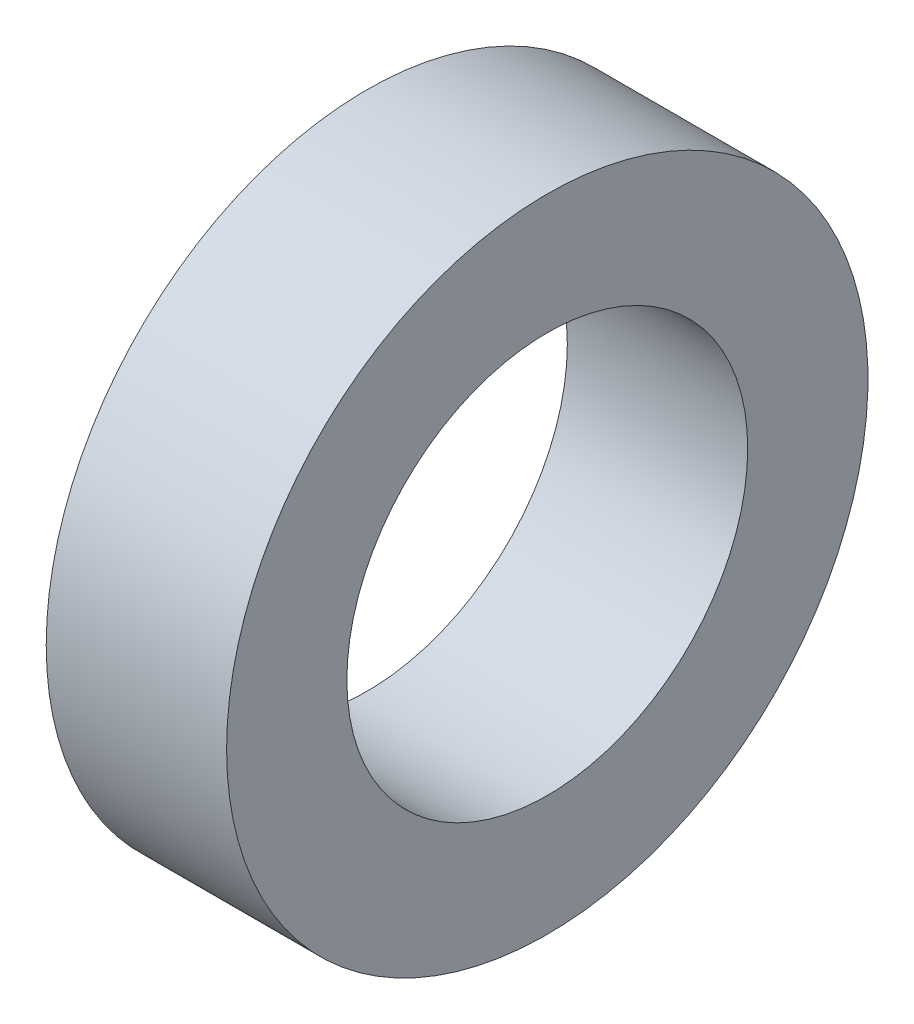
ISO-10303-21;
HEADER;
FILE_DESCRIPTION(('STEP AP214'),'2;1');
FILE_NAME('part.step','',(''),(''),'','','');
FILE_SCHEMA(('AUTOMOTIVE_DESIGN { 1 0 10303 214 1 1 1 1 }'));
ENDSEC;
DATA;
#1=APPLICATION_CONTEXT('core data for automotive mechanical design processes');
#2=APPLICATION_PROTOCOL_DEFINITION('international standard','automotive_design',2000,#1);
#3=PRODUCT_CONTEXT('',#1,'mechanical');
#4=PRODUCT('Part','Part','',(#3));
#5=PRODUCT_RELATED_PRODUCT_CATEGORY('part','',(#4));
#6=PRODUCT_DEFINITION_FORMATION('','',#4);
#7=PRODUCT_DEFINITION_CONTEXT('part definition',#1,'design');
#8=PRODUCT_DEFINITION('design','',#6,#7);
#9=PRODUCT_DEFINITION_SHAPE('','',#8);
#10=(LENGTH_UNIT() NAMED_UNIT(*) SI_UNIT(.MILLI.,.METRE.));
#11=(NAMED_UNIT(*) PLANE_ANGLE_UNIT() SI_UNIT($,.RADIAN.));
#12=(NAMED_UNIT(*) SI_UNIT($,.STERADIAN.) SOLID_ANGLE_UNIT());
#13=UNCERTAINTY_MEASURE_WITH_UNIT(LENGTH_MEASURE(1.E-05),#10,'distance_accuracy_value','');
#14=(GEOMETRIC_REPRESENTATION_CONTEXT(3) GLOBAL_UNCERTAINTY_ASSIGNED_CONTEXT((#13)) GLOBAL_UNIT_ASSIGNED_CONTEXT((#10,
#11,#12)) REPRESENTATION_CONTEXT('',''));
#15=CARTESIAN_POINT('',(0.,0.,0.));
#16=DIRECTION('',(0.,0.,1.));
#17=DIRECTION('',(1.,0.,0.));
#18=AXIS2_PLACEMENT_3D('',#15,#16,#17);
#19=CARTESIAN_POINT('',(-7.42781186094071,14.8559304703476,0.));
#20=DIRECTION('',(1.,0.,0.));
#21=DIRECTION('',(0.,0.,-1.));
#22=AXIS2_PLACEMENT_3D('',#19,#20,#21);
#23=PLANE('',#22);
#24=CARTESIAN_POINT('',(-7.42781186094071,6.85593047034765,0.));
#25=DIRECTION('',(-1.,0.,0.));
#26=DIRECTION('',(0.,0.,1.));
#27=AXIS2_PLACEMENT_3D('',#24,#25,#26);
#28=CIRCLE('',#27,5.);
#29=CARTESIAN_POINT('',(-7.42781186094071,6.85593047034765,5.));
#30=VERTEX_POINT('',#29);
#31=EDGE_CURVE('E10',#30,#30,#28,.T.);
#32=ORIENTED_EDGE('',*,*,#31,.F.);
#33=EDGE_LOOP('',(#32));
#34=FACE_BOUND('',#33,.T.);
#35=CARTESIAN_POINT('',(-7.42781186094071,6.85593047034765,0.));
#36=DIRECTION('',(-1.,0.,0.));
#37=DIRECTION('',(0.,0.,1.));
#38=AXIS2_PLACEMENT_3D('',#35,#36,#37);
#39=CIRCLE('',#38,8.);
#40=CARTESIAN_POINT('',(-7.42781186094071,6.85593047034765,8.));
#41=VERTEX_POINT('',#40);
#42=EDGE_CURVE('E41',#41,#41,#39,.T.);
#43=ORIENTED_EDGE('',*,*,#42,.T.);
#44=EDGE_LOOP('',(#43));
#45=FACE_BOUND('',#44,.T.);
#46=ADVANCED_FACE('F27',(#34,#45),#23,.F.);
#47=CARTESIAN_POINT('',(-51.7089979550102,6.85593047034765,0.));
#48=DIRECTION('',(-1.,0.,0.));
#49=DIRECTION('',(0.,0.,1.));
#50=AXIS2_PLACEMENT_3D('',#47,#48,#49);
#51=CYLINDRICAL_SURFACE('',#50,5.);
#52=CARTESIAN_POINT('',(-2.92781186094071,6.85593047034765,0.));
#53=DIRECTION('',(-1.,0.,0.));
#54=DIRECTION('',(0.,0.,1.));
#55=AXIS2_PLACEMENT_3D('',#52,#53,#54);
#56=CIRCLE('',#55,5.);
#57=CARTESIAN_POINT('',(-2.92781186094071,6.85593047034765,5.));
#58=VERTEX_POINT('',#57);
#59=EDGE_CURVE('E33',#58,#58,#56,.T.);
#60=ORIENTED_EDGE('',*,*,#59,.F.);
#61=EDGE_LOOP('',(#60));
#62=FACE_BOUND('',#61,.T.);
#63=ORIENTED_EDGE('',*,*,#31,.T.);
#64=EDGE_LOOP('',(#63));
#65=FACE_BOUND('',#64,.T.);
#66=ADVANCED_FACE('F56',(#62,#65),#51,.F.);
#67=CARTESIAN_POINT('',(-2.92781186094071,14.8559304703476,0.));
#68=DIRECTION('',(-1.,0.,0.));
#69=DIRECTION('',(0.,0.,1.));
#70=AXIS2_PLACEMENT_3D('',#67,#68,#69);
#71=PLANE('',#70);
#72=CARTESIAN_POINT('',(-2.92781186094072,6.85593047034765,0.));
#73=DIRECTION('',(-1.,0.,0.));
#74=DIRECTION('',(0.,0.,1.));
#75=AXIS2_PLACEMENT_3D('',#72,#73,#74);
#76=CIRCLE('',#75,8.);
#77=CARTESIAN_POINT('',(-2.92781186094072,6.85593047034765,8.));
#78=VERTEX_POINT('',#77);
#79=EDGE_CURVE('E37',#78,#78,#76,.T.);
#80=ORIENTED_EDGE('',*,*,#79,.F.);
#81=EDGE_LOOP('',(#80));
#82=FACE_BOUND('',#81,.T.);
#83=ORIENTED_EDGE('',*,*,#59,.T.);
#84=EDGE_LOOP('',(#83));
#85=FACE_BOUND('',#84,.T.);
#86=ADVANCED_FACE('F51',(#82,#85),#71,.F.);
#87=CARTESIAN_POINT('',(-51.7089979550102,6.85593047034765,0.));
#88=DIRECTION('',(-1.,0.,0.));
#89=DIRECTION('',(0.,0.,1.));
#90=AXIS2_PLACEMENT_3D('',#87,#88,#89);
#91=CYLINDRICAL_SURFACE('',#90,8.);
#92=ORIENTED_EDGE('',*,*,#42,.F.);
#93=EDGE_LOOP('',(#92));
#94=FACE_BOUND('',#93,.T.);
#95=ORIENTED_EDGE('',*,*,#79,.T.);
#96=EDGE_LOOP('',(#95));
#97=FACE_BOUND('',#96,.T.);
#98=ADVANCED_FACE('F48',(#94,#97),#91,.T.);
#99=CLOSED_SHELL('',(#46,#66,#86,#98));
#100=MANIFOLD_SOLID_BREP('B2',#99);
#101=ADVANCED_BREP_SHAPE_REPRESENTATION('',(#18,#100),#14);
#102=SHAPE_DEFINITION_REPRESENTATION(#9,#101);
ENDSEC;
END-ISO-10303-21;
